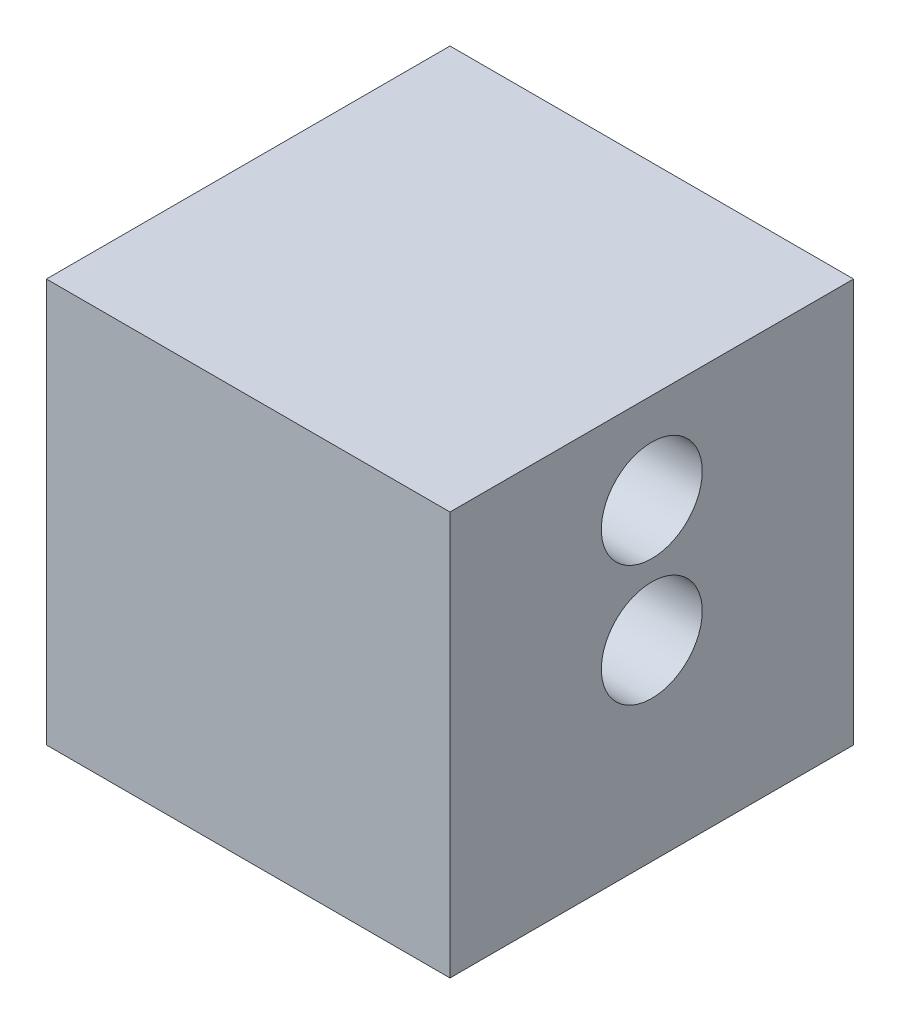
ISO-10303-21;
HEADER;
FILE_DESCRIPTION(('STEP AP214'),'2;1');
FILE_NAME('part.step','',(''),(''),'','','');
FILE_SCHEMA(('AUTOMOTIVE_DESIGN { 1 0 10303 214 1 1 1 1 }'));
ENDSEC;
DATA;
#1=APPLICATION_CONTEXT('core data for automotive mechanical design processes');
#2=APPLICATION_PROTOCOL_DEFINITION('international standard','automotive_design',2000,#1);
#3=PRODUCT_CONTEXT('',#1,'mechanical');
#4=PRODUCT('Part','Part','',(#3));
#5=PRODUCT_RELATED_PRODUCT_CATEGORY('part','',(#4));
#6=PRODUCT_DEFINITION_FORMATION('','',#4);
#7=PRODUCT_DEFINITION_CONTEXT('part definition',#1,'design');
#8=PRODUCT_DEFINITION('design','',#6,#7);
#9=PRODUCT_DEFINITION_SHAPE('','',#8);
#10=(LENGTH_UNIT() NAMED_UNIT(*) SI_UNIT(.MILLI.,.METRE.));
#11=(NAMED_UNIT(*) PLANE_ANGLE_UNIT() SI_UNIT($,.RADIAN.));
#12=(NAMED_UNIT(*) SI_UNIT($,.STERADIAN.) SOLID_ANGLE_UNIT());
#13=UNCERTAINTY_MEASURE_WITH_UNIT(LENGTH_MEASURE(1.E-05),#10,'distance_accuracy_value','');
#14=(GEOMETRIC_REPRESENTATION_CONTEXT(3) GLOBAL_UNCERTAINTY_ASSIGNED_CONTEXT((#13)) GLOBAL_UNIT_ASSIGNED_CONTEXT((#10,
#11,#12)) REPRESENTATION_CONTEXT('',''));
#15=CARTESIAN_POINT('',(0.,0.,0.));
#16=DIRECTION('',(0.,0.,1.));
#17=DIRECTION('',(1.,0.,0.));
#18=AXIS2_PLACEMENT_3D('',#15,#16,#17);
#19=CARTESIAN_POINT('',(0.,20.,0.));
#20=DIRECTION('',(-1.,0.,0.));
#21=DIRECTION('',(0.,0.,1.));
#22=AXIS2_PLACEMENT_3D('',#19,#20,#21);
#23=PLANE('',#22);
#24=CARTESIAN_POINT('',(0.,9.5,-10.));
#25=DIRECTION('',(1.,0.,0.));
#26=DIRECTION('',(0.,0.,-1.));
#27=AXIS2_PLACEMENT_3D('',#24,#25,#26);
#28=CIRCLE('',#27,2.5);
#29=CARTESIAN_POINT('',(0.,9.5,-12.5));
#30=VERTEX_POINT('',#29);
#31=EDGE_CURVE('E120',#30,#30,#28,.T.);
#32=ORIENTED_EDGE('',*,*,#31,.F.);
#33=EDGE_LOOP('',(#32));
#34=FACE_BOUND('',#33,.T.);
#35=CARTESIAN_POINT('',(0.,15.5,-10.));
#36=DIRECTION('',(1.,0.,0.));
#37=DIRECTION('',(0.,0.,-1.));
#38=AXIS2_PLACEMENT_3D('',#35,#36,#37);
#39=CIRCLE('',#38,2.5);
#40=CARTESIAN_POINT('',(0.,15.5,-12.5));
#41=VERTEX_POINT('',#40);
#42=EDGE_CURVE('E114',#41,#41,#39,.T.);
#43=ORIENTED_EDGE('',*,*,#42,.F.);
#44=EDGE_LOOP('',(#43));
#45=FACE_BOUND('',#44,.T.);
#46=DIRECTION('',(0.,0.,-1.));
#47=VECTOR('',#46,1.);
#48=CARTESIAN_POINT('',(0.,0.,0.));
#49=LINE('',#48,#47);
#50=CARTESIAN_POINT('',(0.,0.,0.));
#51=VERTEX_POINT('',#50);
#52=CARTESIAN_POINT('',(0.,0.,-20.));
#53=VERTEX_POINT('',#52);
#54=EDGE_CURVE('E100',#51,#53,#49,.T.);
#55=ORIENTED_EDGE('',*,*,#54,.T.);
#56=DIRECTION('',(0.,-1.,0.));
#57=VECTOR('',#56,1.);
#58=CARTESIAN_POINT('',(0.,20.,-20.));
#59=LINE('',#58,#57);
#60=CARTESIAN_POINT('',(0.,20.,-20.));
#61=VERTEX_POINT('',#60);
#62=EDGE_CURVE('E11',#61,#53,#59,.T.);
#63=ORIENTED_EDGE('',*,*,#62,.F.);
#64=DIRECTION('',(0.,0.,-1.));
#65=VECTOR('',#64,1.);
#66=CARTESIAN_POINT('',(0.,20.,0.));
#67=LINE('',#66,#65);
#68=CARTESIAN_POINT('',(0.,20.,0.));
#69=VERTEX_POINT('',#68);
#70=EDGE_CURVE('E88',#69,#61,#67,.T.);
#71=ORIENTED_EDGE('',*,*,#70,.F.);
#72=DIRECTION('',(0.,-1.,0.));
#73=VECTOR('',#72,1.);
#74=CARTESIAN_POINT('',(0.,20.,0.));
#75=LINE('',#74,#73);
#76=EDGE_CURVE('E96',#69,#51,#75,.T.);
#77=ORIENTED_EDGE('',*,*,#76,.T.);
#78=EDGE_LOOP('',(#55,#63,#71,#77));
#79=FACE_BOUND('',#78,.T.);
#80=ADVANCED_FACE('F37',(#34,#45,#79),#23,.F.);
#81=CARTESIAN_POINT('',(0.,20.,-20.));
#82=DIRECTION('',(0.,0.,1.));
#83=DIRECTION('',(1.,0.,0.));
#84=AXIS2_PLACEMENT_3D('',#81,#82,#83);
#85=PLANE('',#84);
#86=DIRECTION('',(-1.,0.,0.));
#87=VECTOR('',#86,1.);
#88=CARTESIAN_POINT('',(0.,0.,-20.));
#89=LINE('',#88,#87);
#90=CARTESIAN_POINT('',(-20.,0.,-20.));
#91=VERTEX_POINT('',#90);
#92=EDGE_CURVE('E92',#53,#91,#89,.T.);
#93=ORIENTED_EDGE('',*,*,#92,.T.);
#94=DIRECTION('',(0.,-1.,0.));
#95=VECTOR('',#94,1.);
#96=CARTESIAN_POINT('',(-20.,20.,-20.));
#97=LINE('',#96,#95);
#98=CARTESIAN_POINT('',(-20.,20.,-20.));
#99=VERTEX_POINT('',#98);
#100=EDGE_CURVE('E45',#99,#91,#97,.T.);
#101=ORIENTED_EDGE('',*,*,#100,.F.);
#102=DIRECTION('',(-1.,0.,0.));
#103=VECTOR('',#102,1.);
#104=CARTESIAN_POINT('',(0.,20.,-20.));
#105=LINE('',#104,#103);
#106=EDGE_CURVE('E83',#61,#99,#105,.T.);
#107=ORIENTED_EDGE('',*,*,#106,.F.);
#108=ORIENTED_EDGE('',*,*,#62,.T.);
#109=EDGE_LOOP('',(#93,#101,#107,#108));
#110=FACE_BOUND('',#109,.T.);
#111=ADVANCED_FACE('F91',(#110),#85,.F.);
#112=CARTESIAN_POINT('',(-20.,20.,0.));
#113=DIRECTION('',(1.,0.,0.));
#114=DIRECTION('',(0.,0.,-1.));
#115=AXIS2_PLACEMENT_3D('',#112,#113,#114);
#116=PLANE('',#115);
#117=CARTESIAN_POINT('',(-20.,15.5,-10.));
#118=DIRECTION('',(1.,0.,0.));
#119=DIRECTION('',(0.,0.,-1.));
#120=AXIS2_PLACEMENT_3D('',#117,#118,#119);
#121=CIRCLE('',#120,2.5);
#122=CARTESIAN_POINT('',(-20.,15.5,-12.5));
#123=VERTEX_POINT('',#122);
#124=EDGE_CURVE('E103',#123,#123,#121,.T.);
#125=ORIENTED_EDGE('',*,*,#124,.T.);
#126=EDGE_LOOP('',(#125));
#127=FACE_BOUND('',#126,.T.);
#128=DIRECTION('',(0.,0.,1.));
#129=VECTOR('',#128,1.);
#130=CARTESIAN_POINT('',(-20.,0.,0.));
#131=LINE('',#130,#129);
#132=CARTESIAN_POINT('',(-20.,0.,0.));
#133=VERTEX_POINT('',#132);
#134=EDGE_CURVE('E70',#91,#133,#131,.T.);
#135=ORIENTED_EDGE('',*,*,#134,.T.);
#136=DIRECTION('',(0.,-1.,0.));
#137=VECTOR('',#136,1.);
#138=CARTESIAN_POINT('',(-20.,20.,0.));
#139=LINE('',#138,#137);
#140=CARTESIAN_POINT('',(-20.,20.,0.));
#141=VERTEX_POINT('',#140);
#142=EDGE_CURVE('E93',#141,#133,#139,.T.);
#143=ORIENTED_EDGE('',*,*,#142,.F.);
#144=DIRECTION('',(0.,0.,1.));
#145=VECTOR('',#144,1.);
#146=CARTESIAN_POINT('',(-20.,20.,0.));
#147=LINE('',#146,#145);
#148=EDGE_CURVE('E86',#99,#141,#147,.T.);
#149=ORIENTED_EDGE('',*,*,#148,.F.);
#150=ORIENTED_EDGE('',*,*,#100,.T.);
#151=EDGE_LOOP('',(#135,#143,#149,#150));
#152=FACE_BOUND('',#151,.T.);
#153=ADVANCED_FACE('F94',(#127,#152),#116,.F.);
#154=CARTESIAN_POINT('',(0.,20.,0.));
#155=DIRECTION('',(0.,0.,-1.));
#156=DIRECTION('',(-1.,0.,0.));
#157=AXIS2_PLACEMENT_3D('',#154,#155,#156);
#158=PLANE('',#157);
#159=DIRECTION('',(1.,0.,0.));
#160=VECTOR('',#159,1.);
#161=CARTESIAN_POINT('',(0.,0.,0.));
#162=LINE('',#161,#160);
#163=EDGE_CURVE('E76',#133,#51,#162,.T.);
#164=ORIENTED_EDGE('',*,*,#163,.T.);
#165=ORIENTED_EDGE('',*,*,#76,.F.);
#166=DIRECTION('',(1.,0.,0.));
#167=VECTOR('',#166,1.);
#168=CARTESIAN_POINT('',(0.,20.,0.));
#169=LINE('',#168,#167);
#170=EDGE_CURVE('E53',#141,#69,#169,.T.);
#171=ORIENTED_EDGE('',*,*,#170,.F.);
#172=ORIENTED_EDGE('',*,*,#142,.T.);
#173=EDGE_LOOP('',(#164,#165,#171,#172));
#174=FACE_BOUND('',#173,.T.);
#175=ADVANCED_FACE('F108',(#174),#158,.F.);
#176=CARTESIAN_POINT('',(0.,20.,0.));
#177=DIRECTION('',(0.,1.,0.));
#178=DIRECTION('',(0.,0.,1.));
#179=AXIS2_PLACEMENT_3D('',#176,#177,#178);
#180=PLANE('',#179);
#181=ORIENTED_EDGE('',*,*,#70,.T.);
#182=ORIENTED_EDGE('',*,*,#106,.T.);
#183=ORIENTED_EDGE('',*,*,#148,.T.);
#184=ORIENTED_EDGE('',*,*,#170,.T.);
#185=EDGE_LOOP('',(#181,#182,#183,#184));
#186=FACE_BOUND('',#185,.T.);
#187=ADVANCED_FACE('F84',(#186),#180,.T.);
#188=CARTESIAN_POINT('',(0.,0.,0.));
#189=DIRECTION('',(0.,1.,0.));
#190=DIRECTION('',(0.,0.,1.));
#191=AXIS2_PLACEMENT_3D('',#188,#189,#190);
#192=PLANE('',#191);
#193=ORIENTED_EDGE('',*,*,#54,.F.);
#194=ORIENTED_EDGE('',*,*,#163,.F.);
#195=ORIENTED_EDGE('',*,*,#134,.F.);
#196=ORIENTED_EDGE('',*,*,#92,.F.);
#197=EDGE_LOOP('',(#193,#194,#195,#196));
#198=FACE_BOUND('',#197,.T.);
#199=ADVANCED_FACE('F111',(#198),#192,.F.);
#200=CARTESIAN_POINT('',(-20.,15.5,-10.));
#201=DIRECTION('',(1.,0.,0.));
#202=DIRECTION('',(0.,0.,-1.));
#203=AXIS2_PLACEMENT_3D('',#200,#201,#202);
#204=CYLINDRICAL_SURFACE('',#203,2.5);
#205=ORIENTED_EDGE('',*,*,#124,.F.);
#206=EDGE_LOOP('',(#205));
#207=FACE_BOUND('',#206,.T.);
#208=ORIENTED_EDGE('',*,*,#42,.T.);
#209=EDGE_LOOP('',(#208));
#210=FACE_BOUND('',#209,.T.);
#211=ADVANCED_FACE('F131',(#207,#210),#204,.F.);
#212=CARTESIAN_POINT('',(-15.,9.5,-10.));
#213=DIRECTION('',(1.,0.,0.));
#214=DIRECTION('',(0.,0.,-1.));
#215=AXIS2_PLACEMENT_3D('',#212,#213,#214);
#216=CYLINDRICAL_SURFACE('',#215,2.5);
#217=CARTESIAN_POINT('',(-15.,9.5,-10.));
#218=DIRECTION('',(1.,0.,0.));
#219=DIRECTION('',(0.,0.,-1.));
#220=AXIS2_PLACEMENT_3D('',#217,#218,#219);
#221=CIRCLE('',#220,2.5);
#222=CARTESIAN_POINT('',(-15.,9.5,-12.5));
#223=VERTEX_POINT('',#222);
#224=EDGE_CURVE('E117',#223,#223,#221,.T.);
#225=ORIENTED_EDGE('',*,*,#224,.F.);
#226=EDGE_LOOP('',(#225));
#227=FACE_BOUND('',#226,.T.);
#228=ORIENTED_EDGE('',*,*,#31,.T.);
#229=EDGE_LOOP('',(#228));
#230=FACE_BOUND('',#229,.T.);
#231=ADVANCED_FACE('F128',(#227,#230),#216,.F.);
#232=CARTESIAN_POINT('',(-15.,9.5,-10.));
#233=DIRECTION('',(1.,0.,0.));
#234=DIRECTION('',(0.,0.,-1.));
#235=AXIS2_PLACEMENT_3D('',#232,#233,#234);
#236=PLANE('',#235);
#237=ORIENTED_EDGE('',*,*,#224,.T.);
#238=EDGE_LOOP('',(#237));
#239=FACE_BOUND('',#238,.T.);
#240=ADVANCED_FACE('F126',(#239),#236,.T.);
#241=CLOSED_SHELL('',(#80,#111,#153,#175,#187,#199,#211,#231,#240));
#242=MANIFOLD_SOLID_BREP('B2',#241);
#243=ADVANCED_BREP_SHAPE_REPRESENTATION('',(#18,#242),#14);
#244=SHAPE_DEFINITION_REPRESENTATION(#9,#243);
ENDSEC;
END-ISO-10303-21;
